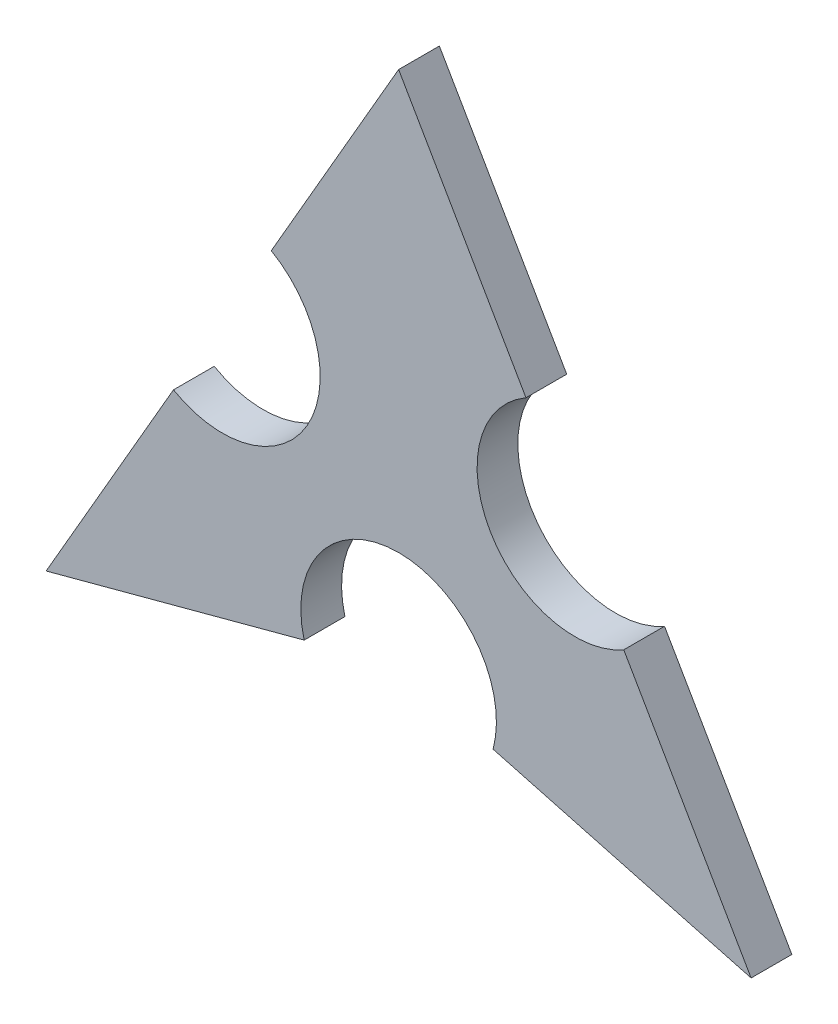
ISO-10303-21;
HEADER;
FILE_DESCRIPTION(('STEP AP214'),'2;1');
FILE_NAME('part.step','',(''),(''),'','','');
FILE_SCHEMA(('AUTOMOTIVE_DESIGN { 1 0 10303 214 1 1 1 1 }'));
ENDSEC;
DATA;
#1=APPLICATION_CONTEXT('core data for automotive mechanical design processes');
#2=APPLICATION_PROTOCOL_DEFINITION('international standard','automotive_design',2000,#1);
#3=PRODUCT_CONTEXT('',#1,'mechanical');
#4=PRODUCT('Part','Part','',(#3));
#5=PRODUCT_RELATED_PRODUCT_CATEGORY('part','',(#4));
#6=PRODUCT_DEFINITION_FORMATION('','',#4);
#7=PRODUCT_DEFINITION_CONTEXT('part definition',#1,'design');
#8=PRODUCT_DEFINITION('design','',#6,#7);
#9=PRODUCT_DEFINITION_SHAPE('','',#8);
#10=(LENGTH_UNIT() NAMED_UNIT(*) SI_UNIT(.MILLI.,.METRE.));
#11=(NAMED_UNIT(*) PLANE_ANGLE_UNIT() SI_UNIT($,.RADIAN.));
#12=(NAMED_UNIT(*) SI_UNIT($,.STERADIAN.) SOLID_ANGLE_UNIT());
#13=UNCERTAINTY_MEASURE_WITH_UNIT(LENGTH_MEASURE(1.E-05),#10,'distance_accuracy_value','');
#14=(GEOMETRIC_REPRESENTATION_CONTEXT(3) GLOBAL_UNCERTAINTY_ASSIGNED_CONTEXT((#13)) GLOBAL_UNIT_ASSIGNED_CONTEXT((#10,
#11,#12)) REPRESENTATION_CONTEXT('',''));
#15=CARTESIAN_POINT('',(0.,0.,0.));
#16=DIRECTION('',(0.,0.,1.));
#17=DIRECTION('',(1.,0.,0.));
#18=AXIS2_PLACEMENT_3D('',#15,#16,#17);
#19=CARTESIAN_POINT('',(32.4375,18.7277993568385,5.));
#20=DIRECTION('',(0.866025403784438,0.5,0.));
#21=DIRECTION('',(-0.5,0.866025403784438,0.));
#22=AXIS2_PLACEMENT_3D('',#19,#20,#21);
#23=PLANE('',#22);
#24=DIRECTION('',(0.5,-0.866025403784439,0.));
#25=VECTOR('',#24,1.);
#26=CARTESIAN_POINT('',(32.4375,18.7277993568385,-5.));
#27=LINE('',#26,#25);
#28=CARTESIAN_POINT('',(55.25,-20.7846096908265,-5.));
#29=VERTEX_POINT('',#28);
#30=CARTESIAN_POINT('',(86.5,-74.9111974273539,-5.));
#31=VERTEX_POINT('',#30);
#32=EDGE_CURVE('E138',#29,#31,#27,.T.);
#33=ORIENTED_EDGE('',*,*,#32,.F.);
#34=DIRECTION('',(0.,0.,-1.));
#35=VECTOR('',#34,1.);
#36=CARTESIAN_POINT('',(55.25,-20.7846096908265,5.));
#37=LINE('',#36,#35);
#38=CARTESIAN_POINT('',(55.25,-20.7846096908265,5.));
#39=VERTEX_POINT('',#38);
#40=EDGE_CURVE('E11',#39,#29,#37,.T.);
#41=ORIENTED_EDGE('',*,*,#40,.F.);
#42=DIRECTION('',(0.5,-0.866025403784439,0.));
#43=VECTOR('',#42,1.);
#44=CARTESIAN_POINT('',(32.4375,18.7277993568385,5.));
#45=LINE('',#44,#43);
#46=CARTESIAN_POINT('',(86.5,-74.9111974273539,5.));
#47=VERTEX_POINT('',#46);
#48=EDGE_CURVE('E160',#39,#47,#45,.T.);
#49=ORIENTED_EDGE('',*,*,#48,.T.);
#50=DIRECTION('',(0.,0.,-1.));
#51=VECTOR('',#50,1.);
#52=CARTESIAN_POINT('',(86.5,-74.9111974273539,5.));
#53=LINE('',#52,#51);
#54=EDGE_CURVE('E53',#47,#31,#53,.T.);
#55=ORIENTED_EDGE('',*,*,#54,.T.);
#56=EDGE_LOOP('',(#33,#41,#49,#55));
#57=FACE_BOUND('',#56,.T.);
#58=ADVANCED_FACE('F37',(#57),#23,.T.);
#59=CARTESIAN_POINT('',(43.25,0.,5.));
#60=DIRECTION('',(0.,0.,-1.));
#61=DIRECTION('',(-1.,0.,0.));
#62=AXIS2_PLACEMENT_3D('',#59,#60,#61);
#63=CYLINDRICAL_SURFACE('',#62,24.);
#64=CARTESIAN_POINT('',(43.25,0.,-5.));
#65=DIRECTION('',(0.,0.,1.));
#66=DIRECTION('',(1.,0.,0.));
#67=AXIS2_PLACEMENT_3D('',#64,#65,#66);
#68=CIRCLE('',#67,24.);
#69=CARTESIAN_POINT('',(31.25,20.7846096908265,-5.));
#70=VERTEX_POINT('',#69);
#71=EDGE_CURVE('E140',#29,#70,#68,.F.);
#72=ORIENTED_EDGE('',*,*,#71,.T.);
#73=DIRECTION('',(0.,0.,-1.));
#74=VECTOR('',#73,1.);
#75=CARTESIAN_POINT('',(31.25,20.7846096908265,5.));
#76=LINE('',#75,#74);
#77=CARTESIAN_POINT('',(31.25,20.7846096908265,5.));
#78=VERTEX_POINT('',#77);
#79=EDGE_CURVE('E45',#78,#70,#76,.T.);
#80=ORIENTED_EDGE('',*,*,#79,.F.);
#81=CARTESIAN_POINT('',(43.25,0.,5.));
#82=DIRECTION('',(0.,0.,1.));
#83=DIRECTION('',(1.,0.,0.));
#84=AXIS2_PLACEMENT_3D('',#81,#82,#83);
#85=CIRCLE('',#84,24.);
#86=EDGE_CURVE('E192',#39,#78,#85,.F.);
#87=ORIENTED_EDGE('',*,*,#86,.F.);
#88=ORIENTED_EDGE('',*,*,#40,.T.);
#89=EDGE_LOOP('',(#72,#80,#87,#88));
#90=FACE_BOUND('',#89,.T.);
#91=ADVANCED_FACE('F178',(#90),#63,.F.);
#92=CARTESIAN_POINT('',(32.4375,18.7277993568385,5.));
#93=DIRECTION('',(0.866025403784439,0.5,0.));
#94=DIRECTION('',(-0.5,0.866025403784439,0.));
#95=AXIS2_PLACEMENT_3D('',#92,#93,#94);
#96=PLANE('',#95);
#97=DIRECTION('',(0.5,-0.866025403784439,0.));
#98=VECTOR('',#97,1.);
#99=CARTESIAN_POINT('',(32.4375,18.7277993568385,-5.));
#100=LINE('',#99,#98);
#101=CARTESIAN_POINT('',(0.,74.911197427354,-5.));
#102=VERTEX_POINT('',#101);
#103=EDGE_CURVE('E143',#102,#70,#100,.T.);
#104=ORIENTED_EDGE('',*,*,#103,.F.);
#105=DIRECTION('',(0.,0.,-1.));
#106=VECTOR('',#105,1.);
#107=CARTESIAN_POINT('',(0.,74.911197427354,5.));
#108=LINE('',#107,#106);
#109=CARTESIAN_POINT('',(0.,74.911197427354,5.));
#110=VERTEX_POINT('',#109);
#111=EDGE_CURVE('E168',#110,#102,#108,.T.);
#112=ORIENTED_EDGE('',*,*,#111,.F.);
#113=DIRECTION('',(0.5,-0.866025403784439,0.));
#114=VECTOR('',#113,1.);
#115=CARTESIAN_POINT('',(32.4375,18.7277993568385,5.));
#116=LINE('',#115,#114);
#117=EDGE_CURVE('E175',#110,#78,#116,.T.);
#118=ORIENTED_EDGE('',*,*,#117,.T.);
#119=ORIENTED_EDGE('',*,*,#79,.T.);
#120=EDGE_LOOP('',(#104,#112,#118,#119));
#121=FACE_BOUND('',#120,.T.);
#122=ADVANCED_FACE('F173',(#121),#96,.T.);
#123=CARTESIAN_POINT('',(-32.4375,18.7277993568385,5.));
#124=DIRECTION('',(0.866025403784439,-0.5,0.));
#125=DIRECTION('',(0.5,0.866025403784439,0.));
#126=AXIS2_PLACEMENT_3D('',#123,#124,#125);
#127=PLANE('',#126);
#128=DIRECTION('',(-0.5,-0.866025403784439,0.));
#129=VECTOR('',#128,1.);
#130=CARTESIAN_POINT('',(-32.4375,18.7277993568385,-5.));
#131=LINE('',#130,#129);
#132=CARTESIAN_POINT('',(-31.25,20.7846096908265,-5.));
#133=VERTEX_POINT('',#132);
#134=EDGE_CURVE('E146',#102,#133,#131,.T.);
#135=ORIENTED_EDGE('',*,*,#134,.T.);
#136=DIRECTION('',(0.,0.,-1.));
#137=VECTOR('',#136,1.);
#138=CARTESIAN_POINT('',(-31.25,20.7846096908265,5.));
#139=LINE('',#138,#137);
#140=CARTESIAN_POINT('',(-31.25,20.7846096908265,5.));
#141=VERTEX_POINT('',#140);
#142=EDGE_CURVE('E166',#141,#133,#139,.T.);
#143=ORIENTED_EDGE('',*,*,#142,.F.);
#144=DIRECTION('',(-0.5,-0.866025403784439,0.));
#145=VECTOR('',#144,1.);
#146=CARTESIAN_POINT('',(-32.4375,18.7277993568385,5.));
#147=LINE('',#146,#145);
#148=EDGE_CURVE('E189',#110,#141,#147,.T.);
#149=ORIENTED_EDGE('',*,*,#148,.F.);
#150=ORIENTED_EDGE('',*,*,#111,.T.);
#151=EDGE_LOOP('',(#135,#143,#149,#150));
#152=FACE_BOUND('',#151,.T.);
#153=ADVANCED_FACE('F186',(#152),#127,.F.);
#154=CARTESIAN_POINT('',(-43.25,0.,5.));
#155=DIRECTION('',(0.,0.,-1.));
#156=DIRECTION('',(-1.,0.,0.));
#157=AXIS2_PLACEMENT_3D('',#154,#155,#156);
#158=CYLINDRICAL_SURFACE('',#157,24.);
#159=CARTESIAN_POINT('',(-43.25,0.,-5.));
#160=DIRECTION('',(0.,0.,1.));
#161=DIRECTION('',(1.,0.,0.));
#162=AXIS2_PLACEMENT_3D('',#159,#160,#161);
#163=CIRCLE('',#162,24.);
#164=CARTESIAN_POINT('',(-55.25,-20.7846096908265,-5.));
#165=VERTEX_POINT('',#164);
#166=EDGE_CURVE('E149',#165,#133,#163,.T.);
#167=ORIENTED_EDGE('',*,*,#166,.F.);
#168=DIRECTION('',(0.,0.,-1.));
#169=VECTOR('',#168,1.);
#170=CARTESIAN_POINT('',(-55.25,-20.7846096908265,5.));
#171=LINE('',#170,#169);
#172=CARTESIAN_POINT('',(-55.25,-20.7846096908265,5.));
#173=VERTEX_POINT('',#172);
#174=EDGE_CURVE('E164',#173,#165,#171,.T.);
#175=ORIENTED_EDGE('',*,*,#174,.F.);
#176=CARTESIAN_POINT('',(-43.25,0.,5.));
#177=DIRECTION('',(0.,0.,1.));
#178=DIRECTION('',(1.,0.,0.));
#179=AXIS2_PLACEMENT_3D('',#176,#177,#178);
#180=CIRCLE('',#179,24.);
#181=EDGE_CURVE('E190',#173,#141,#180,.T.);
#182=ORIENTED_EDGE('',*,*,#181,.T.);
#183=ORIENTED_EDGE('',*,*,#142,.T.);
#184=EDGE_LOOP('',(#167,#175,#182,#183));
#185=FACE_BOUND('',#184,.T.);
#186=ADVANCED_FACE('F198',(#185),#158,.F.);
#187=CARTESIAN_POINT('',(-32.4375,18.7277993568385,5.));
#188=DIRECTION('',(0.866025403784438,-0.5,0.));
#189=DIRECTION('',(0.5,0.866025403784438,0.));
#190=AXIS2_PLACEMENT_3D('',#187,#188,#189);
#191=PLANE('',#190);
#192=DIRECTION('',(-0.5,-0.866025403784439,0.));
#193=VECTOR('',#192,1.);
#194=CARTESIAN_POINT('',(-32.4375,18.7277993568385,-5.));
#195=LINE('',#194,#193);
#196=CARTESIAN_POINT('',(-86.5,-74.9111974273539,-5.));
#197=VERTEX_POINT('',#196);
#198=EDGE_CURVE('E152',#165,#197,#195,.T.);
#199=ORIENTED_EDGE('',*,*,#198,.T.);
#200=DIRECTION('',(0.,0.,-1.));
#201=VECTOR('',#200,1.);
#202=CARTESIAN_POINT('',(-86.5,-74.9111974273539,5.));
#203=LINE('',#202,#201);
#204=CARTESIAN_POINT('',(-86.5,-74.9111974273539,5.));
#205=VERTEX_POINT('',#204);
#206=EDGE_CURVE('E130',#205,#197,#203,.T.);
#207=ORIENTED_EDGE('',*,*,#206,.F.);
#208=DIRECTION('',(-0.5,-0.866025403784439,0.));
#209=VECTOR('',#208,1.);
#210=CARTESIAN_POINT('',(-32.4375,18.7277993568385,5.));
#211=LINE('',#210,#209);
#212=EDGE_CURVE('E118',#173,#205,#211,.T.);
#213=ORIENTED_EDGE('',*,*,#212,.F.);
#214=ORIENTED_EDGE('',*,*,#174,.T.);
#215=EDGE_LOOP('',(#199,#207,#213,#214));
#216=FACE_BOUND('',#215,.T.);
#217=ADVANCED_FACE('F200',(#216),#191,.F.);
#218=CARTESIAN_POINT('',(12.9333980705156,-48.2680987136764,5.));
#219=DIRECTION('',(-0.258819045102526,0.965925826289067,0.));
#220=DIRECTION('',(-0.965925826289067,-0.258819045102526,0.));
#221=AXIS2_PLACEMENT_3D('',#218,#219,#220);
#222=PLANE('',#221);
#223=DIRECTION('',(0.965925826289067,0.258819045102526,0.));
#224=VECTOR('',#223,1.);
#225=CARTESIAN_POINT('',(12.9333980705156,-48.2680987136764,-5.));
#226=LINE('',#225,#224);
#227=CARTESIAN_POINT('',(-23.1822198309376,-57.9452493645219,-5.));
#228=VERTEX_POINT('',#227);
#229=EDGE_CURVE('E127',#197,#228,#226,.T.);
#230=ORIENTED_EDGE('',*,*,#229,.T.);
#231=DIRECTION('',(0.,0.,-1.));
#232=VECTOR('',#231,1.);
#233=CARTESIAN_POINT('',(-23.1822198309376,-57.9452493645219,5.));
#234=LINE('',#233,#232);
#235=CARTESIAN_POINT('',(-23.1822198309376,-57.9452493645219,5.));
#236=VERTEX_POINT('',#235);
#237=EDGE_CURVE('E124',#236,#228,#234,.T.);
#238=ORIENTED_EDGE('',*,*,#237,.F.);
#239=DIRECTION('',(0.965925826289067,0.258819045102526,0.));
#240=VECTOR('',#239,1.);
#241=CARTESIAN_POINT('',(12.9333980705156,-48.2680987136764,5.));
#242=LINE('',#241,#240);
#243=EDGE_CURVE('E109',#205,#236,#242,.T.);
#244=ORIENTED_EDGE('',*,*,#243,.F.);
#245=ORIENTED_EDGE('',*,*,#206,.T.);
#246=EDGE_LOOP('',(#230,#238,#244,#245));
#247=FACE_BOUND('',#246,.T.);
#248=ADVANCED_FACE('F125',(#247),#222,.F.);
#249=CARTESIAN_POINT('',(0.,-51.7335922820613,5.));
#250=DIRECTION('',(0.,0.,-1.));
#251=DIRECTION('',(-1.,0.,0.));
#252=AXIS2_PLACEMENT_3D('',#249,#250,#251);
#253=CYLINDRICAL_SURFACE('',#252,24.);
#254=CARTESIAN_POINT('',(0.,-51.7335922820613,-5.));
#255=DIRECTION('',(0.,0.,1.));
#256=DIRECTION('',(1.,0.,0.));
#257=AXIS2_PLACEMENT_3D('',#254,#255,#256);
#258=CIRCLE('',#257,24.);
#259=CARTESIAN_POINT('',(23.1822198309376,-57.9452493645219,-5.));
#260=VERTEX_POINT('',#259);
#261=EDGE_CURVE('E155',#260,#228,#258,.T.);
#262=ORIENTED_EDGE('',*,*,#261,.F.);
#263=DIRECTION('',(0.,0.,-1.));
#264=VECTOR('',#263,1.);
#265=CARTESIAN_POINT('',(23.1822198309376,-57.9452493645219,5.));
#266=LINE('',#265,#264);
#267=CARTESIAN_POINT('',(23.1822198309376,-57.9452493645219,5.));
#268=VERTEX_POINT('',#267);
#269=EDGE_CURVE('E81',#268,#260,#266,.T.);
#270=ORIENTED_EDGE('',*,*,#269,.F.);
#271=CARTESIAN_POINT('',(0.,-51.7335922820613,5.));
#272=DIRECTION('',(0.,0.,1.));
#273=DIRECTION('',(1.,0.,0.));
#274=AXIS2_PLACEMENT_3D('',#271,#272,#273);
#275=CIRCLE('',#274,24.);
#276=EDGE_CURVE('E115',#268,#236,#275,.T.);
#277=ORIENTED_EDGE('',*,*,#276,.T.);
#278=ORIENTED_EDGE('',*,*,#237,.T.);
#279=EDGE_LOOP('',(#262,#270,#277,#278));
#280=FACE_BOUND('',#279,.T.);
#281=ADVANCED_FACE('F132',(#280),#253,.F.);
#282=CARTESIAN_POINT('',(-12.9333980705156,-48.2680987136763,5.));
#283=DIRECTION('',(-0.258819045102526,-0.965925826289067,0.));
#284=DIRECTION('',(0.965925826289067,-0.258819045102526,0.));
#285=AXIS2_PLACEMENT_3D('',#282,#283,#284);
#286=PLANE('',#285);
#287=DIRECTION('',(-0.965925826289067,0.258819045102526,0.));
#288=VECTOR('',#287,1.);
#289=CARTESIAN_POINT('',(-12.9333980705156,-48.2680987136763,-5.));
#290=LINE('',#289,#288);
#291=EDGE_CURVE('E157',#31,#260,#290,.T.);
#292=ORIENTED_EDGE('',*,*,#291,.F.);
#293=ORIENTED_EDGE('',*,*,#54,.F.);
#294=DIRECTION('',(-0.965925826289067,0.258819045102526,0.));
#295=VECTOR('',#294,1.);
#296=CARTESIAN_POINT('',(-12.9333980705156,-48.2680987136763,5.));
#297=LINE('',#296,#295);
#298=EDGE_CURVE('E133',#47,#268,#297,.T.);
#299=ORIENTED_EDGE('',*,*,#298,.T.);
#300=ORIENTED_EDGE('',*,*,#269,.T.);
#301=EDGE_LOOP('',(#292,#293,#299,#300));
#302=FACE_BOUND('',#301,.T.);
#303=ADVANCED_FACE('F201',(#302),#286,.T.);
#304=CARTESIAN_POINT('',(0.,0.,5.));
#305=DIRECTION('',(0.,0.,1.));
#306=DIRECTION('',(1.,0.,0.));
#307=AXIS2_PLACEMENT_3D('',#304,#305,#306);
#308=PLANE('',#307);
#309=ORIENTED_EDGE('',*,*,#48,.F.);
#310=ORIENTED_EDGE('',*,*,#86,.T.);
#311=ORIENTED_EDGE('',*,*,#117,.F.);
#312=ORIENTED_EDGE('',*,*,#148,.T.);
#313=ORIENTED_EDGE('',*,*,#181,.F.);
#314=ORIENTED_EDGE('',*,*,#212,.T.);
#315=ORIENTED_EDGE('',*,*,#243,.T.);
#316=ORIENTED_EDGE('',*,*,#276,.F.);
#317=ORIENTED_EDGE('',*,*,#298,.F.);
#318=EDGE_LOOP('',(#309,#310,#311,#312,#313,#314,#315,#316,#317));
#319=FACE_BOUND('',#318,.T.);
#320=ADVANCED_FACE('F112',(#319),#308,.T.);
#321=CARTESIAN_POINT('',(0.,0.,-5.));
#322=DIRECTION('',(0.,0.,1.));
#323=DIRECTION('',(1.,0.,0.));
#324=AXIS2_PLACEMENT_3D('',#321,#322,#323);
#325=PLANE('',#324);
#326=ORIENTED_EDGE('',*,*,#32,.T.);
#327=ORIENTED_EDGE('',*,*,#291,.T.);
#328=ORIENTED_EDGE('',*,*,#261,.T.);
#329=ORIENTED_EDGE('',*,*,#229,.F.);
#330=ORIENTED_EDGE('',*,*,#198,.F.);
#331=ORIENTED_EDGE('',*,*,#166,.T.);
#332=ORIENTED_EDGE('',*,*,#134,.F.);
#333=ORIENTED_EDGE('',*,*,#103,.T.);
#334=ORIENTED_EDGE('',*,*,#71,.F.);
#335=EDGE_LOOP('',(#326,#327,#328,#329,#330,#331,#332,#333,#334));
#336=FACE_BOUND('',#335,.T.);
#337=ADVANCED_FACE('F181',(#336),#325,.F.);
#338=CLOSED_SHELL('',(#58,#91,#122,#153,#186,#217,#248,#281,#303,#320,#337));
#339=MANIFOLD_SOLID_BREP('B2',#338);
#340=ADVANCED_BREP_SHAPE_REPRESENTATION('',(#18,#339),#14);
#341=SHAPE_DEFINITION_REPRESENTATION(#9,#340);
ENDSEC;
END-ISO-10303-21;
